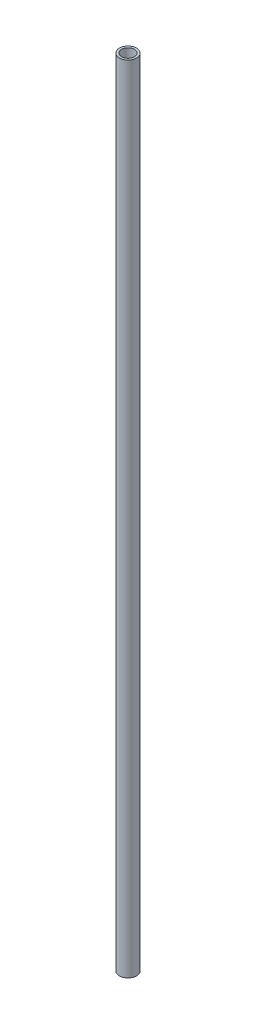
ISO-10303-21;
HEADER;
FILE_DESCRIPTION(('STEP AP214'),'2;1');
FILE_NAME('part.step','',(''),(''),'','','');
FILE_SCHEMA(('AUTOMOTIVE_DESIGN { 1 0 10303 214 1 1 1 1 }'));
ENDSEC;
DATA;
#1=APPLICATION_CONTEXT('core data for automotive mechanical design processes');
#2=APPLICATION_PROTOCOL_DEFINITION('international standard','automotive_design',2000,#1);
#3=PRODUCT_CONTEXT('',#1,'mechanical');
#4=PRODUCT('Part','Part','',(#3));
#5=PRODUCT_RELATED_PRODUCT_CATEGORY('part','',(#4));
#6=PRODUCT_DEFINITION_FORMATION('','',#4);
#7=PRODUCT_DEFINITION_CONTEXT('part definition',#1,'design');
#8=PRODUCT_DEFINITION('design','',#6,#7);
#9=PRODUCT_DEFINITION_SHAPE('','',#8);
#10=(LENGTH_UNIT() NAMED_UNIT(*) SI_UNIT(.MILLI.,.METRE.));
#11=(NAMED_UNIT(*) PLANE_ANGLE_UNIT() SI_UNIT($,.RADIAN.));
#12=(NAMED_UNIT(*) SI_UNIT($,.STERADIAN.) SOLID_ANGLE_UNIT());
#13=UNCERTAINTY_MEASURE_WITH_UNIT(LENGTH_MEASURE(1.E-05),#10,'distance_accuracy_value','');
#14=(GEOMETRIC_REPRESENTATION_CONTEXT(3) GLOBAL_UNCERTAINTY_ASSIGNED_CONTEXT((#13)) GLOBAL_UNIT_ASSIGNED_CONTEXT((#10,
#11,#12)) REPRESENTATION_CONTEXT('',''));
#15=CARTESIAN_POINT('',(0.,0.,0.));
#16=DIRECTION('',(0.,0.,1.));
#17=DIRECTION('',(1.,0.,0.));
#18=AXIS2_PLACEMENT_3D('',#15,#16,#17);
#19=CARTESIAN_POINT('',(0.,370.,0.));
#20=DIRECTION('',(0.,1.,0.));
#21=DIRECTION('',(0.,0.,1.));
#22=AXIS2_PLACEMENT_3D('',#19,#20,#21);
#23=PLANE('',#22);
#24=CARTESIAN_POINT('',(0.,370.,0.));
#25=DIRECTION('',(0.,1.,0.));
#26=DIRECTION('',(0.,0.,1.));
#27=AXIS2_PLACEMENT_3D('',#24,#25,#26);
#28=CIRCLE('',#27,4.);
#29=CARTESIAN_POINT('',(0.,370.,4.));
#30=VERTEX_POINT('',#29);
#31=EDGE_CURVE('E10',#30,#30,#28,.T.);
#32=ORIENTED_EDGE('',*,*,#31,.T.);
#33=EDGE_LOOP('',(#32));
#34=FACE_BOUND('',#33,.T.);
#35=CARTESIAN_POINT('',(0.,370.,0.));
#36=DIRECTION('',(0.,1.,0.));
#37=DIRECTION('',(0.,0.,1.));
#38=AXIS2_PLACEMENT_3D('',#35,#36,#37);
#39=CIRCLE('',#38,3.);
#40=CARTESIAN_POINT('',(0.,370.,3.));
#41=VERTEX_POINT('',#40);
#42=EDGE_CURVE('E48',#41,#41,#39,.T.);
#43=ORIENTED_EDGE('',*,*,#42,.F.);
#44=EDGE_LOOP('',(#43));
#45=FACE_BOUND('',#44,.T.);
#46=ADVANCED_FACE('F40',(#34,#45),#23,.T.);
#47=CARTESIAN_POINT('',(0.,0.,0.));
#48=DIRECTION('',(0.,1.,0.));
#49=DIRECTION('',(0.,0.,1.));
#50=AXIS2_PLACEMENT_3D('',#47,#48,#49);
#51=PLANE('',#50);
#52=CARTESIAN_POINT('',(0.,0.,0.));
#53=DIRECTION('',(0.,1.,0.));
#54=DIRECTION('',(0.,0.,1.));
#55=AXIS2_PLACEMENT_3D('',#52,#53,#54);
#56=CIRCLE('',#55,4.);
#57=CARTESIAN_POINT('',(0.,0.,4.));
#58=VERTEX_POINT('',#57);
#59=EDGE_CURVE('E41',#58,#58,#56,.T.);
#60=ORIENTED_EDGE('',*,*,#59,.F.);
#61=EDGE_LOOP('',(#60));
#62=FACE_BOUND('',#61,.T.);
#63=CARTESIAN_POINT('',(0.,0.,0.));
#64=DIRECTION('',(0.,1.,0.));
#65=DIRECTION('',(0.,0.,1.));
#66=AXIS2_PLACEMENT_3D('',#63,#64,#65);
#67=CIRCLE('',#66,3.);
#68=CARTESIAN_POINT('',(0.,0.,3.));
#69=VERTEX_POINT('',#68);
#70=EDGE_CURVE('E49',#69,#69,#67,.T.);
#71=ORIENTED_EDGE('',*,*,#70,.T.);
#72=EDGE_LOOP('',(#71));
#73=FACE_BOUND('',#72,.T.);
#74=ADVANCED_FACE('F58',(#62,#73),#51,.F.);
#75=CARTESIAN_POINT('',(0.,370.,0.));
#76=DIRECTION('',(0.,-1.,0.));
#77=DIRECTION('',(0.,0.,-1.));
#78=AXIS2_PLACEMENT_3D('',#75,#76,#77);
#79=CYLINDRICAL_SURFACE('',#78,4.);
#80=ORIENTED_EDGE('',*,*,#31,.F.);
#81=EDGE_LOOP('',(#80));
#82=FACE_BOUND('',#81,.T.);
#83=ORIENTED_EDGE('',*,*,#59,.T.);
#84=EDGE_LOOP('',(#83));
#85=FACE_BOUND('',#84,.T.);
#86=ADVANCED_FACE('F39',(#82,#85),#79,.T.);
#87=CARTESIAN_POINT('',(0.,370.,0.));
#88=DIRECTION('',(0.,-1.,0.));
#89=DIRECTION('',(0.,0.,-1.));
#90=AXIS2_PLACEMENT_3D('',#87,#88,#89);
#91=CYLINDRICAL_SURFACE('',#90,3.);
#92=ORIENTED_EDGE('',*,*,#42,.T.);
#93=EDGE_LOOP('',(#92));
#94=FACE_BOUND('',#93,.T.);
#95=ORIENTED_EDGE('',*,*,#70,.F.);
#96=EDGE_LOOP('',(#95));
#97=FACE_BOUND('',#96,.T.);
#98=ADVANCED_FACE('F57',(#94,#97),#91,.F.);
#99=CLOSED_SHELL('',(#46,#74,#86,#98));
#100=MANIFOLD_SOLID_BREP('B2',#99);
#101=ADVANCED_BREP_SHAPE_REPRESENTATION('',(#18,#100),#14);
#102=SHAPE_DEFINITION_REPRESENTATION(#9,#101);
ENDSEC;
END-ISO-10303-21;
